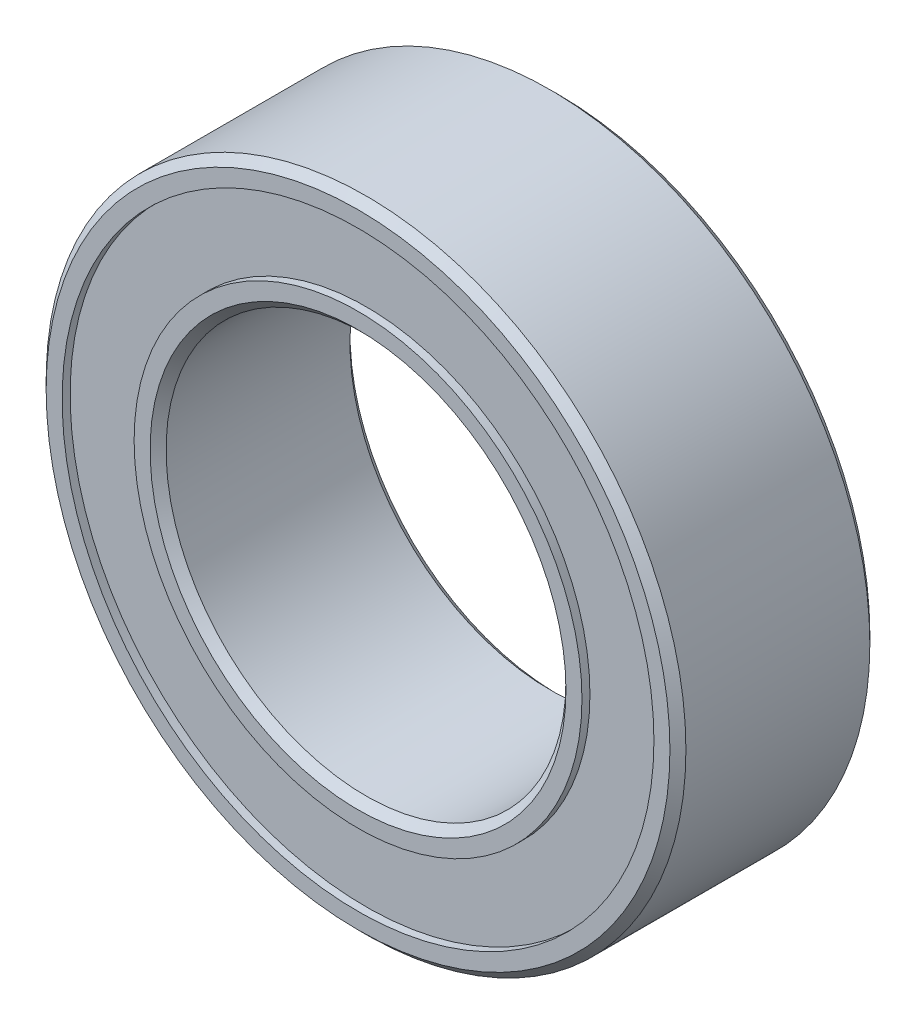
ISO-10303-21;
HEADER;
FILE_DESCRIPTION(('STEP AP214'),'2;1');
FILE_NAME('part.step','',(''),(''),'','','');
FILE_SCHEMA(('AUTOMOTIVE_DESIGN { 1 0 10303 214 1 1 1 1 }'));
ENDSEC;
DATA;
#1=APPLICATION_CONTEXT('core data for automotive mechanical design processes');
#2=APPLICATION_PROTOCOL_DEFINITION('international standard','automotive_design',2000,#1);
#3=PRODUCT_CONTEXT('',#1,'mechanical');
#4=PRODUCT('Part','Part','',(#3));
#5=PRODUCT_RELATED_PRODUCT_CATEGORY('part','',(#4));
#6=PRODUCT_DEFINITION_FORMATION('','',#4);
#7=PRODUCT_DEFINITION_CONTEXT('part definition',#1,'design');
#8=PRODUCT_DEFINITION('design','',#6,#7);
#9=PRODUCT_DEFINITION_SHAPE('','',#8);
#10=(LENGTH_UNIT() NAMED_UNIT(*) SI_UNIT(.MILLI.,.METRE.));
#11=(NAMED_UNIT(*) PLANE_ANGLE_UNIT() SI_UNIT($,.RADIAN.));
#12=(NAMED_UNIT(*) SI_UNIT($,.STERADIAN.) SOLID_ANGLE_UNIT());
#13=UNCERTAINTY_MEASURE_WITH_UNIT(LENGTH_MEASURE(1.E-05),#10,'distance_accuracy_value','');
#14=(GEOMETRIC_REPRESENTATION_CONTEXT(3) GLOBAL_UNCERTAINTY_ASSIGNED_CONTEXT((#13)) GLOBAL_UNIT_ASSIGNED_CONTEXT((#10,
#11,#12)) REPRESENTATION_CONTEXT('',''));
#15=CARTESIAN_POINT('',(0.,0.,0.));
#16=DIRECTION('',(0.,0.,1.));
#17=DIRECTION('',(1.,0.,0.));
#18=AXIS2_PLACEMENT_3D('',#15,#16,#17);
#19=CARTESIAN_POINT('',(0.,0.,-1.25));
#20=DIRECTION('',(0.,0.,1.));
#21=DIRECTION('',(1.,0.,0.));
#22=AXIS2_PLACEMENT_3D('',#19,#20,#21);
#23=PLANE('',#22);
#24=CARTESIAN_POINT('',(0.,0.,-1.25));
#25=DIRECTION('',(0.,0.,1.));
#26=DIRECTION('',(1.,0.,0.));
#27=AXIS2_PLACEMENT_3D('',#24,#25,#26);
#28=CIRCLE('',#27,2.6);
#29=CARTESIAN_POINT('',(2.6,0.,-1.25));
#30=VERTEX_POINT('',#29);
#31=EDGE_CURVE('E44',#30,#30,#28,.T.);
#32=ORIENTED_EDGE('',*,*,#31,.T.);
#33=EDGE_LOOP('',(#32));
#34=FACE_BOUND('',#33,.T.);
#35=CARTESIAN_POINT('',(0.,0.,-1.25));
#36=DIRECTION('',(0.,0.,1.));
#37=DIRECTION('',(1.,0.,0.));
#38=AXIS2_PLACEMENT_3D('',#35,#36,#37);
#39=CIRCLE('',#38,2.8);
#40=CARTESIAN_POINT('',(2.8,0.,-1.25));
#41=VERTEX_POINT('',#40);
#42=EDGE_CURVE('E66',#41,#41,#39,.T.);
#43=ORIENTED_EDGE('',*,*,#42,.F.);
#44=EDGE_LOOP('',(#43));
#45=FACE_BOUND('',#44,.T.);
#46=ADVANCED_FACE('F15',(#34,#45),#23,.F.);
#47=CARTESIAN_POINT('',(0.,0.,1.25));
#48=DIRECTION('',(0.,0.,1.));
#49=DIRECTION('',(1.,0.,0.));
#50=AXIS2_PLACEMENT_3D('',#47,#48,#49);
#51=PLANE('',#50);
#52=CARTESIAN_POINT('',(0.,0.,1.25));
#53=DIRECTION('',(0.,0.,1.));
#54=DIRECTION('',(1.,0.,0.));
#55=AXIS2_PLACEMENT_3D('',#52,#53,#54);
#56=CIRCLE('',#55,2.6);
#57=CARTESIAN_POINT('',(2.6,0.,1.25));
#58=VERTEX_POINT('',#57);
#59=EDGE_CURVE('E22',#58,#58,#56,.F.);
#60=ORIENTED_EDGE('',*,*,#59,.T.);
#61=EDGE_LOOP('',(#60));
#62=FACE_BOUND('',#61,.T.);
#63=CARTESIAN_POINT('',(0.,0.,1.25));
#64=DIRECTION('',(0.,0.,1.));
#65=DIRECTION('',(1.,0.,0.));
#66=AXIS2_PLACEMENT_3D('',#63,#64,#65);
#67=CIRCLE('',#66,2.8);
#68=CARTESIAN_POINT('',(2.8,0.,1.25));
#69=VERTEX_POINT('',#68);
#70=EDGE_CURVE('E54',#69,#69,#67,.T.);
#71=ORIENTED_EDGE('',*,*,#70,.T.);
#72=EDGE_LOOP('',(#71));
#73=FACE_BOUND('',#72,.T.);
#74=ADVANCED_FACE('F83',(#62,#73),#51,.T.);
#75=CARTESIAN_POINT('',(0.,0.,1.25));
#76=DIRECTION('',(0.,0.,1.));
#77=DIRECTION('',(1.,0.,0.));
#78=AXIS2_PLACEMENT_3D('',#75,#76,#77);
#79=CIRCLE('',#78,3.9);
#80=CARTESIAN_POINT('',(3.9,0.,1.25));
#81=VERTEX_POINT('',#80);
#82=EDGE_CURVE('E10',#81,#81,#79,.T.);
#83=ORIENTED_EDGE('',*,*,#82,.T.);
#84=EDGE_LOOP('',(#83));
#85=FACE_BOUND('',#84,.T.);
#86=CARTESIAN_POINT('',(0.,0.,1.25));
#87=DIRECTION('',(0.,0.,1.));
#88=DIRECTION('',(1.,0.,0.));
#89=AXIS2_PLACEMENT_3D('',#86,#87,#88);
#90=CIRCLE('',#89,3.7);
#91=CARTESIAN_POINT('',(3.7,0.,1.25));
#92=VERTEX_POINT('',#91);
#93=EDGE_CURVE('E48',#92,#92,#90,.T.);
#94=ORIENTED_EDGE('',*,*,#93,.F.);
#95=EDGE_LOOP('',(#94));
#96=FACE_BOUND('',#95,.T.);
#97=ADVANCED_FACE('F92',(#85,#96),#51,.T.);
#98=CARTESIAN_POINT('',(0.,0.,-1.25));
#99=DIRECTION('',(0.,0.,1.));
#100=DIRECTION('',(1.,0.,0.));
#101=AXIS2_PLACEMENT_3D('',#98,#99,#100);
#102=CIRCLE('',#101,3.9);
#103=CARTESIAN_POINT('',(3.9,0.,-1.25));
#104=VERTEX_POINT('',#103);
#105=EDGE_CURVE('E26',#104,#104,#102,.F.);
#106=ORIENTED_EDGE('',*,*,#105,.T.);
#107=EDGE_LOOP('',(#106));
#108=FACE_BOUND('',#107,.T.);
#109=CARTESIAN_POINT('',(0.,0.,-1.25));
#110=DIRECTION('',(0.,0.,1.));
#111=DIRECTION('',(1.,0.,0.));
#112=AXIS2_PLACEMENT_3D('',#109,#110,#111);
#113=CIRCLE('',#112,3.7);
#114=CARTESIAN_POINT('',(3.7,0.,-1.25));
#115=VERTEX_POINT('',#114);
#116=EDGE_CURVE('E60',#115,#115,#113,.T.);
#117=ORIENTED_EDGE('',*,*,#116,.T.);
#118=EDGE_LOOP('',(#117));
#119=FACE_BOUND('',#118,.T.);
#120=ADVANCED_FACE('F86',(#108,#119),#23,.F.);
#121=CARTESIAN_POINT('',(0.,0.,1.25));
#122=DIRECTION('',(0.,0.,-1.));
#123=DIRECTION('',(-1.,0.,0.));
#124=AXIS2_PLACEMENT_3D('',#121,#122,#123);
#125=CYLINDRICAL_SURFACE('',#124,4.);
#126=CARTESIAN_POINT('',(0.,0.,-1.15));
#127=DIRECTION('',(0.,0.,1.));
#128=DIRECTION('',(1.,0.,0.));
#129=AXIS2_PLACEMENT_3D('',#126,#127,#128);
#130=CIRCLE('',#129,4.);
#131=CARTESIAN_POINT('',(4.,0.,-1.15));
#132=VERTEX_POINT('',#131);
#133=EDGE_CURVE('E30',#132,#132,#130,.T.);
#134=ORIENTED_EDGE('',*,*,#133,.T.);
#135=EDGE_LOOP('',(#134));
#136=FACE_BOUND('',#135,.T.);
#137=CARTESIAN_POINT('',(0.,0.,1.15));
#138=DIRECTION('',(0.,0.,1.));
#139=DIRECTION('',(1.,0.,0.));
#140=AXIS2_PLACEMENT_3D('',#137,#138,#139);
#141=CIRCLE('',#140,4.);
#142=CARTESIAN_POINT('',(4.,0.,1.15));
#143=VERTEX_POINT('',#142);
#144=EDGE_CURVE('E35',#143,#143,#141,.F.);
#145=ORIENTED_EDGE('',*,*,#144,.T.);
#146=EDGE_LOOP('',(#145));
#147=FACE_BOUND('',#146,.T.);
#148=ADVANCED_FACE('F96',(#136,#147),#125,.T.);
#149=CARTESIAN_POINT('',(0.,0.,1.25));
#150=DIRECTION('',(0.,0.,-1.));
#151=DIRECTION('',(-1.,0.,0.));
#152=AXIS2_PLACEMENT_3D('',#149,#150,#151);
#153=CYLINDRICAL_SURFACE('',#152,2.5);
#154=CARTESIAN_POINT('',(0.,0.,-1.15));
#155=DIRECTION('',(0.,0.,1.));
#156=DIRECTION('',(1.,0.,0.));
#157=AXIS2_PLACEMENT_3D('',#154,#155,#156);
#158=CIRCLE('',#157,2.5);
#159=CARTESIAN_POINT('',(2.5,0.,-1.15));
#160=VERTEX_POINT('',#159);
#161=EDGE_CURVE('E38',#160,#160,#158,.F.);
#162=ORIENTED_EDGE('',*,*,#161,.T.);
#163=EDGE_LOOP('',(#162));
#164=FACE_BOUND('',#163,.T.);
#165=CARTESIAN_POINT('',(0.,0.,1.15));
#166=DIRECTION('',(0.,0.,1.));
#167=DIRECTION('',(1.,0.,0.));
#168=AXIS2_PLACEMENT_3D('',#165,#166,#167);
#169=CIRCLE('',#168,2.5);
#170=CARTESIAN_POINT('',(2.5,0.,1.15));
#171=VERTEX_POINT('',#170);
#172=EDGE_CURVE('E41',#171,#171,#169,.T.);
#173=ORIENTED_EDGE('',*,*,#172,.T.);
#174=EDGE_LOOP('',(#173));
#175=FACE_BOUND('',#174,.T.);
#176=ADVANCED_FACE('F103',(#164,#175),#153,.F.);
#177=CARTESIAN_POINT('',(0.,0.,1.15));
#178=DIRECTION('',(0.,0.,1.));
#179=DIRECTION('',(1.,0.,0.));
#180=AXIS2_PLACEMENT_3D('',#177,#178,#179);
#181=CYLINDRICAL_SURFACE('',#180,3.7);
#182=CARTESIAN_POINT('',(0.,0.,1.15));
#183=DIRECTION('',(0.,0.,1.));
#184=DIRECTION('',(1.,0.,0.));
#185=AXIS2_PLACEMENT_3D('',#182,#183,#184);
#186=CIRCLE('',#185,3.7);
#187=CARTESIAN_POINT('',(3.7,0.,1.15));
#188=VERTEX_POINT('',#187);
#189=EDGE_CURVE('E47',#188,#188,#186,.T.);
#190=ORIENTED_EDGE('',*,*,#189,.F.);
#191=EDGE_LOOP('',(#190));
#192=FACE_BOUND('',#191,.T.);
#193=ORIENTED_EDGE('',*,*,#93,.T.);
#194=EDGE_LOOP('',(#193));
#195=FACE_BOUND('',#194,.T.);
#196=ADVANCED_FACE('F126',(#192,#195),#181,.F.);
#197=CARTESIAN_POINT('',(0.,0.,1.15));
#198=DIRECTION('',(0.,0.,1.));
#199=DIRECTION('',(1.,0.,0.));
#200=AXIS2_PLACEMENT_3D('',#197,#198,#199);
#201=PLANE('',#200);
#202=CARTESIAN_POINT('',(0.,0.,1.15));
#203=DIRECTION('',(0.,0.,1.));
#204=DIRECTION('',(1.,0.,0.));
#205=AXIS2_PLACEMENT_3D('',#202,#203,#204);
#206=CIRCLE('',#205,2.8);
#207=CARTESIAN_POINT('',(2.8,0.,1.15));
#208=VERTEX_POINT('',#207);
#209=EDGE_CURVE('E51',#208,#208,#206,.T.);
#210=ORIENTED_EDGE('',*,*,#209,.F.);
#211=EDGE_LOOP('',(#210));
#212=FACE_BOUND('',#211,.T.);
#213=ORIENTED_EDGE('',*,*,#189,.T.);
#214=EDGE_LOOP('',(#213));
#215=FACE_BOUND('',#214,.T.);
#216=ADVANCED_FACE('F122',(#212,#215),#201,.T.);
#217=CARTESIAN_POINT('',(0.,0.,1.15));
#218=DIRECTION('',(0.,0.,1.));
#219=DIRECTION('',(1.,0.,0.));
#220=AXIS2_PLACEMENT_3D('',#217,#218,#219);
#221=CYLINDRICAL_SURFACE('',#220,2.8);
#222=ORIENTED_EDGE('',*,*,#209,.T.);
#223=EDGE_LOOP('',(#222));
#224=FACE_BOUND('',#223,.T.);
#225=ORIENTED_EDGE('',*,*,#70,.F.);
#226=EDGE_LOOP('',(#225));
#227=FACE_BOUND('',#226,.T.);
#228=ADVANCED_FACE('F116',(#224,#227),#221,.T.);
#229=CARTESIAN_POINT('',(0.,0.,-1.15));
#230=DIRECTION('',(0.,0.,-1.));
#231=DIRECTION('',(1.,0.,0.));
#232=AXIS2_PLACEMENT_3D('',#229,#230,#231);
#233=PLANE('',#232);
#234=CARTESIAN_POINT('',(0.,0.,-1.15));
#235=DIRECTION('',(0.,0.,1.));
#236=DIRECTION('',(1.,0.,0.));
#237=AXIS2_PLACEMENT_3D('',#234,#235,#236);
#238=CIRCLE('',#237,3.7);
#239=CARTESIAN_POINT('',(3.7,0.,-1.15));
#240=VERTEX_POINT('',#239);
#241=EDGE_CURVE('E57',#240,#240,#238,.T.);
#242=ORIENTED_EDGE('',*,*,#241,.F.);
#243=EDGE_LOOP('',(#242));
#244=FACE_BOUND('',#243,.T.);
#245=CARTESIAN_POINT('',(0.,0.,-1.15));
#246=DIRECTION('',(0.,0.,1.));
#247=DIRECTION('',(1.,0.,0.));
#248=AXIS2_PLACEMENT_3D('',#245,#246,#247);
#249=CIRCLE('',#248,2.8);
#250=CARTESIAN_POINT('',(2.8,0.,-1.15));
#251=VERTEX_POINT('',#250);
#252=EDGE_CURVE('E63',#251,#251,#249,.T.);
#253=ORIENTED_EDGE('',*,*,#252,.T.);
#254=EDGE_LOOP('',(#253));
#255=FACE_BOUND('',#254,.T.);
#256=ADVANCED_FACE('F72',(#244,#255),#233,.T.);
#257=CARTESIAN_POINT('',(0.,0.,-1.15));
#258=DIRECTION('',(0.,0.,-1.));
#259=DIRECTION('',(-1.,0.,0.));
#260=AXIS2_PLACEMENT_3D('',#257,#258,#259);
#261=CYLINDRICAL_SURFACE('',#260,3.7);
#262=ORIENTED_EDGE('',*,*,#241,.T.);
#263=EDGE_LOOP('',(#262));
#264=FACE_BOUND('',#263,.T.);
#265=ORIENTED_EDGE('',*,*,#116,.F.);
#266=EDGE_LOOP('',(#265));
#267=FACE_BOUND('',#266,.T.);
#268=ADVANCED_FACE('F78',(#264,#267),#261,.F.);
#269=CARTESIAN_POINT('',(0.,0.,-1.15));
#270=DIRECTION('',(0.,0.,-1.));
#271=DIRECTION('',(-1.,0.,0.));
#272=AXIS2_PLACEMENT_3D('',#269,#270,#271);
#273=CYLINDRICAL_SURFACE('',#272,2.8);
#274=ORIENTED_EDGE('',*,*,#252,.F.);
#275=EDGE_LOOP('',(#274));
#276=FACE_BOUND('',#275,.T.);
#277=ORIENTED_EDGE('',*,*,#42,.T.);
#278=EDGE_LOOP('',(#277));
#279=FACE_BOUND('',#278,.T.);
#280=ADVANCED_FACE('F74',(#276,#279),#273,.T.);
#281=CARTESIAN_POINT('',(0.,0.,-1.25));
#282=DIRECTION('',(0.,0.,-1.));
#283=DIRECTION('',(-1.,0.,0.));
#284=AXIS2_PLACEMENT_3D('',#281,#282,#283);
#285=CONICAL_SURFACE('',#284,2.6,0.78539816339745);
#286=ORIENTED_EDGE('',*,*,#161,.F.);
#287=EDGE_LOOP('',(#286));
#288=FACE_BOUND('',#287,.T.);
#289=ORIENTED_EDGE('',*,*,#31,.F.);
#290=EDGE_LOOP('',(#289));
#291=FACE_BOUND('',#290,.T.);
#292=ADVANCED_FACE('F77',(#288,#291),#285,.F.);
#293=CARTESIAN_POINT('',(0.,0.,-1.15));
#294=DIRECTION('',(0.,0.,1.));
#295=DIRECTION('',(1.,0.,0.));
#296=AXIS2_PLACEMENT_3D('',#293,#294,#295);
#297=CONICAL_SURFACE('',#296,4.,0.785398163397448);
#298=ORIENTED_EDGE('',*,*,#105,.F.);
#299=EDGE_LOOP('',(#298));
#300=FACE_BOUND('',#299,.T.);
#301=ORIENTED_EDGE('',*,*,#133,.F.);
#302=EDGE_LOOP('',(#301));
#303=FACE_BOUND('',#302,.T.);
#304=ADVANCED_FACE('F142',(#300,#303),#297,.T.);
#305=CARTESIAN_POINT('',(0.,0.,1.15));
#306=DIRECTION('',(0.,0.,1.));
#307=DIRECTION('',(1.,0.,0.));
#308=AXIS2_PLACEMENT_3D('',#305,#306,#307);
#309=CONICAL_SURFACE('',#308,2.5,0.785398163397459);
#310=ORIENTED_EDGE('',*,*,#59,.F.);
#311=EDGE_LOOP('',(#310));
#312=FACE_BOUND('',#311,.T.);
#313=ORIENTED_EDGE('',*,*,#172,.F.);
#314=EDGE_LOOP('',(#313));
#315=FACE_BOUND('',#314,.T.);
#316=ADVANCED_FACE('F140',(#312,#315),#309,.F.);
#317=CARTESIAN_POINT('',(0.,0.,1.25));
#318=DIRECTION('',(0.,0.,-1.));
#319=DIRECTION('',(-1.,0.,0.));
#320=AXIS2_PLACEMENT_3D('',#317,#318,#319);
#321=CONICAL_SURFACE('',#320,3.9,0.785398163397457);
#322=ORIENTED_EDGE('',*,*,#144,.F.);
#323=EDGE_LOOP('',(#322));
#324=FACE_BOUND('',#323,.T.);
#325=ORIENTED_EDGE('',*,*,#82,.F.);
#326=EDGE_LOOP('',(#325));
#327=FACE_BOUND('',#326,.T.);
#328=ADVANCED_FACE('F17',(#324,#327),#321,.T.);
#329=CLOSED_SHELL('',(#46,#74,#97,#120,#148,#176,#196,#216,#228,#256,#268,#280,#292,#304,#316,#328));
#330=MANIFOLD_SOLID_BREP('B1',#329);
#331=ADVANCED_BREP_SHAPE_REPRESENTATION('',(#18,#330),#14);
#332=SHAPE_DEFINITION_REPRESENTATION(#9,#331);
ENDSEC;
END-ISO-10303-21;
